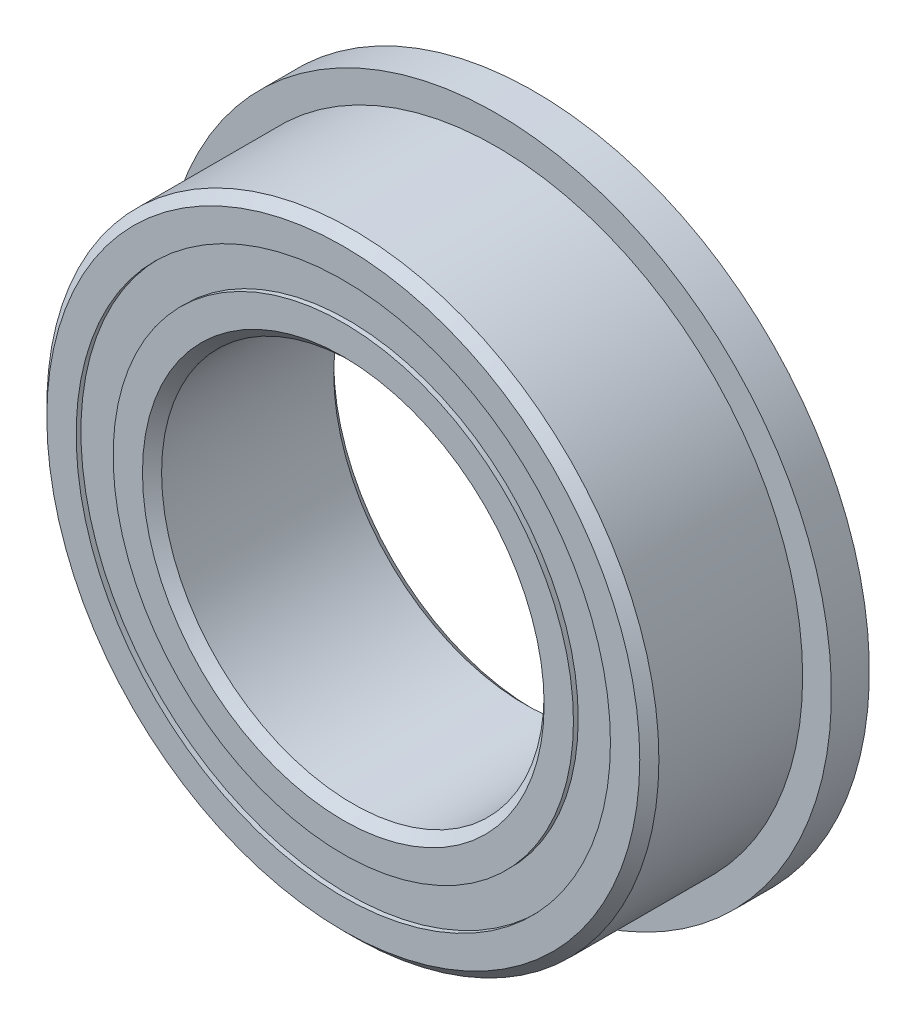
ISO-10303-21;
HEADER;
FILE_DESCRIPTION(('STEP AP214'),'2;1');
FILE_NAME('part.step','',(''),(''),'','','');
FILE_SCHEMA(('AUTOMOTIVE_DESIGN { 1 0 10303 214 1 1 1 1 }'));
ENDSEC;
DATA;
#1=APPLICATION_CONTEXT('core data for automotive mechanical design processes');
#2=APPLICATION_PROTOCOL_DEFINITION('international standard','automotive_design',2000,#1);
#3=PRODUCT_CONTEXT('',#1,'mechanical');
#4=PRODUCT('Part','Part','',(#3));
#5=PRODUCT_RELATED_PRODUCT_CATEGORY('part','',(#4));
#6=PRODUCT_DEFINITION_FORMATION('','',#4);
#7=PRODUCT_DEFINITION_CONTEXT('part definition',#1,'design');
#8=PRODUCT_DEFINITION('design','',#6,#7);
#9=PRODUCT_DEFINITION_SHAPE('','',#8);
#10=(LENGTH_UNIT() NAMED_UNIT(*) SI_UNIT(.MILLI.,.METRE.));
#11=(NAMED_UNIT(*) PLANE_ANGLE_UNIT() SI_UNIT($,.RADIAN.));
#12=(NAMED_UNIT(*) SI_UNIT($,.STERADIAN.) SOLID_ANGLE_UNIT());
#13=UNCERTAINTY_MEASURE_WITH_UNIT(LENGTH_MEASURE(1.E-05),#10,'distance_accuracy_value','');
#14=(GEOMETRIC_REPRESENTATION_CONTEXT(3) GLOBAL_UNCERTAINTY_ASSIGNED_CONTEXT((#13)) GLOBAL_UNIT_ASSIGNED_CONTEXT((#10,
#11,#12)) REPRESENTATION_CONTEXT('',''));
#15=CARTESIAN_POINT('',(0.,0.,0.));
#16=DIRECTION('',(0.,0.,1.));
#17=DIRECTION('',(1.,0.,0.));
#18=AXIS2_PLACEMENT_3D('',#15,#16,#17);
#19=CARTESIAN_POINT('',(0.,5.54316620879121,-1.88515625));
#20=DIRECTION('',(0.,0.,1.));
#21=DIRECTION('',(1.,0.,0.));
#22=AXIS2_PLACEMENT_3D('',#19,#20,#21);
#23=PLANE('',#22);
#24=CARTESIAN_POINT('',(0.,0.,-1.88515625));
#25=DIRECTION('',(0.,0.,1.));
#26=DIRECTION('',(1.,0.,0.));
#27=AXIS2_PLACEMENT_3D('',#24,#25,#26);
#28=CIRCLE('',#27,5.54316620879121);
#29=CARTESIAN_POINT('',(5.54316620879121,0.,-1.88515625));
#30=VERTEX_POINT('',#29);
#31=EDGE_CURVE('E57',#30,#30,#28,.T.);
#32=ORIENTED_EDGE('',*,*,#31,.F.);
#33=EDGE_LOOP('',(#32));
#34=FACE_BOUND('',#33,.T.);
#35=CARTESIAN_POINT('',(0.,0.,-1.88515625));
#36=DIRECTION('',(0.,0.,1.));
#37=DIRECTION('',(1.,0.,0.));
#38=AXIS2_PLACEMENT_3D('',#35,#36,#37);
#39=CIRCLE('',#38,4.77558379120879);
#40=CARTESIAN_POINT('',(4.77558379120879,0.,-1.88515625));
#41=VERTEX_POINT('',#40);
#42=EDGE_CURVE('E11',#41,#41,#39,.T.);
#43=ORIENTED_EDGE('',*,*,#42,.T.);
#44=EDGE_LOOP('',(#43));
#45=FACE_BOUND('',#44,.T.);
#46=ADVANCED_FACE('F43',(#34,#45),#23,.F.);
#47=CARTESIAN_POINT('',(0.,0.,1.984375));
#48=DIRECTION('',(0.,0.,1.));
#49=DIRECTION('',(1.,0.,0.));
#50=AXIS2_PLACEMENT_3D('',#47,#48,#49);
#51=CYLINDRICAL_SURFACE('',#50,4.77558379120879);
#52=ORIENTED_EDGE('',*,*,#42,.F.);
#53=EDGE_LOOP('',(#52));
#54=FACE_BOUND('',#53,.T.);
#55=CARTESIAN_POINT('',(0.,0.,-0.961832467237323));
#56=DIRECTION('',(0.,0.,1.));
#57=DIRECTION('',(1.,0.,0.));
#58=AXIS2_PLACEMENT_3D('',#55,#56,#57);
#59=CIRCLE('',#58,4.77558379120879);
#60=CARTESIAN_POINT('',(4.77558379120879,0.,-0.961832467237323));
#61=VERTEX_POINT('',#60);
#62=EDGE_CURVE('E49',#61,#61,#59,.T.);
#63=ORIENTED_EDGE('',*,*,#62,.T.);
#64=EDGE_LOOP('',(#63));
#65=FACE_BOUND('',#64,.T.);
#66=ADVANCED_FACE('F66',(#54,#65),#51,.F.);
#67=CARTESIAN_POINT('',(0.,5.54316620879121,-0.961832467237323));
#68=DIRECTION('',(0.,0.,-1.));
#69=DIRECTION('',(-1.,0.,0.));
#70=AXIS2_PLACEMENT_3D('',#67,#68,#69);
#71=PLANE('',#70);
#72=ORIENTED_EDGE('',*,*,#62,.F.);
#73=EDGE_LOOP('',(#72));
#74=FACE_BOUND('',#73,.T.);
#75=CARTESIAN_POINT('',(0.,0.,-0.961832467237323));
#76=DIRECTION('',(0.,0.,1.));
#77=DIRECTION('',(1.,0.,0.));
#78=AXIS2_PLACEMENT_3D('',#75,#76,#77);
#79=CIRCLE('',#78,5.54316620879121);
#80=CARTESIAN_POINT('',(5.54316620879121,0.,-0.961832467237323));
#81=VERTEX_POINT('',#80);
#82=EDGE_CURVE('E53',#81,#81,#79,.T.);
#83=ORIENTED_EDGE('',*,*,#82,.T.);
#84=EDGE_LOOP('',(#83));
#85=FACE_BOUND('',#84,.T.);
#86=ADVANCED_FACE('F70',(#74,#85),#71,.F.);
#87=CARTESIAN_POINT('',(0.,0.,1.984375));
#88=DIRECTION('',(0.,0.,1.));
#89=DIRECTION('',(1.,0.,0.));
#90=AXIS2_PLACEMENT_3D('',#87,#88,#89);
#91=CYLINDRICAL_SURFACE('',#90,5.54316620879121);
#92=ORIENTED_EDGE('',*,*,#82,.F.);
#93=EDGE_LOOP('',(#92));
#94=FACE_BOUND('',#93,.T.);
#95=ORIENTED_EDGE('',*,*,#31,.T.);
#96=EDGE_LOOP('',(#95));
#97=FACE_BOUND('',#96,.T.);
#98=ADVANCED_FACE('F63',(#94,#97),#91,.T.);
#99=CLOSED_SHELL('',(#46,#66,#86,#98));
#100=MANIFOLD_SOLID_BREP('B2',#99);
#101=CARTESIAN_POINT('',(0.,5.54316620879121,1.88515625));
#102=DIRECTION('',(0.,0.,-1.));
#103=DIRECTION('',(-1.,0.,0.));
#104=AXIS2_PLACEMENT_3D('',#101,#102,#103);
#105=PLANE('',#104);
#106=CARTESIAN_POINT('',(0.,0.,1.88515625));
#107=DIRECTION('',(0.,0.,1.));
#108=DIRECTION('',(1.,0.,0.));
#109=AXIS2_PLACEMENT_3D('',#106,#107,#108);
#110=CIRCLE('',#109,4.77558379120879);
#111=CARTESIAN_POINT('',(4.77558379120879,0.,1.88515625));
#112=VERTEX_POINT('',#111);
#113=EDGE_CURVE('E42',#112,#112,#110,.T.);
#114=ORIENTED_EDGE('',*,*,#113,.F.);
#115=EDGE_LOOP('',(#114));
#116=FACE_BOUND('',#115,.T.);
#117=CARTESIAN_POINT('',(0.,0.,1.88515625));
#118=DIRECTION('',(0.,0.,1.));
#119=DIRECTION('',(1.,0.,0.));
#120=AXIS2_PLACEMENT_3D('',#117,#118,#119);
#121=CIRCLE('',#120,5.54316620879121);
#122=CARTESIAN_POINT('',(5.54316620879121,0.,1.88515625));
#123=VERTEX_POINT('',#122);
#124=EDGE_CURVE('E124',#123,#123,#121,.T.);
#125=ORIENTED_EDGE('',*,*,#124,.T.);
#126=EDGE_LOOP('',(#125));
#127=FACE_BOUND('',#126,.T.);
#128=ADVANCED_FACE('F110',(#116,#127),#105,.F.);
#129=CARTESIAN_POINT('',(0.,0.,1.984375));
#130=DIRECTION('',(0.,0.,1.));
#131=DIRECTION('',(1.,0.,0.));
#132=AXIS2_PLACEMENT_3D('',#129,#130,#131);
#133=CYLINDRICAL_SURFACE('',#132,4.77558379120879);
#134=CARTESIAN_POINT('',(0.,0.,0.961832467237324));
#135=DIRECTION('',(0.,0.,1.));
#136=DIRECTION('',(1.,0.,0.));
#137=AXIS2_PLACEMENT_3D('',#134,#135,#136);
#138=CIRCLE('',#137,4.77558379120879);
#139=CARTESIAN_POINT('',(4.77558379120879,0.,0.961832467237324));
#140=VERTEX_POINT('',#139);
#141=EDGE_CURVE('E116',#140,#140,#138,.T.);
#142=ORIENTED_EDGE('',*,*,#141,.F.);
#143=EDGE_LOOP('',(#142));
#144=FACE_BOUND('',#143,.T.);
#145=ORIENTED_EDGE('',*,*,#113,.T.);
#146=EDGE_LOOP('',(#145));
#147=FACE_BOUND('',#146,.T.);
#148=ADVANCED_FACE('F139',(#144,#147),#133,.F.);
#149=CARTESIAN_POINT('',(0.,5.54316620879121,0.961832467237324));
#150=DIRECTION('',(0.,0.,1.));
#151=DIRECTION('',(1.,0.,0.));
#152=AXIS2_PLACEMENT_3D('',#149,#150,#151);
#153=PLANE('',#152);
#154=CARTESIAN_POINT('',(0.,0.,0.961832467237324));
#155=DIRECTION('',(0.,0.,1.));
#156=DIRECTION('',(1.,0.,0.));
#157=AXIS2_PLACEMENT_3D('',#154,#155,#156);
#158=CIRCLE('',#157,5.54316620879121);
#159=CARTESIAN_POINT('',(5.54316620879121,0.,0.961832467237324));
#160=VERTEX_POINT('',#159);
#161=EDGE_CURVE('E120',#160,#160,#158,.T.);
#162=ORIENTED_EDGE('',*,*,#161,.F.);
#163=EDGE_LOOP('',(#162));
#164=FACE_BOUND('',#163,.T.);
#165=ORIENTED_EDGE('',*,*,#141,.T.);
#166=EDGE_LOOP('',(#165));
#167=FACE_BOUND('',#166,.T.);
#168=ADVANCED_FACE('F134',(#164,#167),#153,.F.);
#169=CARTESIAN_POINT('',(0.,0.,1.984375));
#170=DIRECTION('',(0.,0.,1.));
#171=DIRECTION('',(1.,0.,0.));
#172=AXIS2_PLACEMENT_3D('',#169,#170,#171);
#173=CYLINDRICAL_SURFACE('',#172,5.54316620879121);
#174=ORIENTED_EDGE('',*,*,#124,.F.);
#175=EDGE_LOOP('',(#174));
#176=FACE_BOUND('',#175,.T.);
#177=ORIENTED_EDGE('',*,*,#161,.T.);
#178=EDGE_LOOP('',(#177));
#179=FACE_BOUND('',#178,.T.);
#180=ADVANCED_FACE('F131',(#176,#179),#173,.T.);
#181=CLOSED_SHELL('',(#128,#148,#168,#180));
#182=MANIFOLD_SOLID_BREP('B6',#181);
#183=CARTESIAN_POINT('',(-2.57968749999994,4.46814981765037,0.));
#184=DIRECTION('',(0.,0.,1.));
#185=DIRECTION('',(-0.499999999999989,0.866025403784445,0.));
#186=AXIS2_PLACEMENT_3D('',#183,#184,#185);
#187=SPHERICAL_SURFACE('',#186,0.961832467237323);
#188=CARTESIAN_POINT('',(-2.57968749999994,4.46814981765037,0.961832467237324));
#189=VERTEX_POINT('',#188);
#190=VERTEX_LOOP('',#189);
#191=FACE_BOUND('',#190,.T.);
#192=ADVANCED_FACE('F177',(#191),#187,.T.);
#193=CLOSED_SHELL('',(#192));
#194=MANIFOLD_SOLID_BREP('B37',#193);
#195=CARTESIAN_POINT('',(-4.46814981765031,2.57968750000005,0.));
#196=DIRECTION('',(0.,0.,1.));
#197=DIRECTION('',(-0.866025403784433,0.50000000000001,0.));
#198=AXIS2_PLACEMENT_3D('',#195,#196,#197);
#199=SPHERICAL_SURFACE('',#198,0.961832467237323);
#200=CARTESIAN_POINT('',(-4.46814981765031,2.57968750000005,0.961832467237324));
#201=VERTEX_POINT('',#200);
#202=VERTEX_LOOP('',#201);
#203=FACE_BOUND('',#202,.T.);
#204=ADVANCED_FACE('F197',(#203),#199,.T.);
#205=CLOSED_SHELL('',(#204));
#206=MANIFOLD_SOLID_BREP('B106',#205);
#207=CARTESIAN_POINT('',(-5.159375,0.,0.));
#208=DIRECTION('',(0.,0.,1.));
#209=DIRECTION('',(-1.,0.,0.));
#210=AXIS2_PLACEMENT_3D('',#207,#208,#209);
#211=SPHERICAL_SURFACE('',#210,0.961832467237323);
#212=CARTESIAN_POINT('',(-5.159375,0.,0.961832467237324));
#213=VERTEX_POINT('',#212);
#214=VERTEX_LOOP('',#213);
#215=FACE_BOUND('',#214,.T.);
#216=ADVANCED_FACE('F217',(#215),#211,.T.);
#217=CLOSED_SHELL('',(#216));
#218=MANIFOLD_SOLID_BREP('B173',#217);
#219=CARTESIAN_POINT('',(-4.46814981765036,-2.57968749999996,0.));
#220=DIRECTION('',(0.,0.,1.));
#221=DIRECTION('',(-0.866025403784443,-0.499999999999992,0.));
#222=AXIS2_PLACEMENT_3D('',#219,#220,#221);
#223=SPHERICAL_SURFACE('',#222,0.961832467237323);
#224=CARTESIAN_POINT('',(-4.46814981765036,-2.57968749999996,0.961832467237324));
#225=VERTEX_POINT('',#224);
#226=VERTEX_LOOP('',#225);
#227=FACE_BOUND('',#226,.T.);
#228=ADVANCED_FACE('F237',(#227),#223,.T.);
#229=CLOSED_SHELL('',(#228));
#230=MANIFOLD_SOLID_BREP('B193',#229);
#231=CARTESIAN_POINT('',(-2.57968750000004,-4.46814981765032,0.));
#232=DIRECTION('',(0.,0.,1.));
#233=DIRECTION('',(-0.500000000000007,-0.866025403784435,0.));
#234=AXIS2_PLACEMENT_3D('',#231,#232,#233);
#235=SPHERICAL_SURFACE('',#234,0.961832467237323);
#236=CARTESIAN_POINT('',(-2.57968750000004,-4.46814981765032,0.961832467237324));
#237=VERTEX_POINT('',#236);
#238=VERTEX_LOOP('',#237);
#239=FACE_BOUND('',#238,.T.);
#240=ADVANCED_FACE('F257',(#239),#235,.T.);
#241=CLOSED_SHELL('',(#240));
#242=MANIFOLD_SOLID_BREP('B213',#241);
#243=CARTESIAN_POINT('',(0.,-5.159375,0.));
#244=DIRECTION('',(0.,0.,1.));
#245=DIRECTION('',(0.,-1.,0.));
#246=AXIS2_PLACEMENT_3D('',#243,#244,#245);
#247=SPHERICAL_SURFACE('',#246,0.961832467237323);
#248=CARTESIAN_POINT('',(0.,-5.159375,0.961832467237324));
#249=VERTEX_POINT('',#248);
#250=VERTEX_LOOP('',#249);
#251=FACE_BOUND('',#250,.T.);
#252=ADVANCED_FACE('F277',(#251),#247,.T.);
#253=CLOSED_SHELL('',(#252));
#254=MANIFOLD_SOLID_BREP('B233',#253);
#255=CARTESIAN_POINT('',(2.57968749999997,-4.46814981765035,0.));
#256=DIRECTION('',(0.,0.,1.));
#257=DIRECTION('',(0.499999999999995,-0.866025403784442,0.));
#258=AXIS2_PLACEMENT_3D('',#255,#256,#257);
#259=SPHERICAL_SURFACE('',#258,0.961832467237323);
#260=CARTESIAN_POINT('',(2.57968749999997,-4.46814981765035,0.961832467237324));
#261=VERTEX_POINT('',#260);
#262=VERTEX_LOOP('',#261);
#263=FACE_BOUND('',#262,.T.);
#264=ADVANCED_FACE('F297',(#263),#259,.T.);
#265=CLOSED_SHELL('',(#264));
#266=MANIFOLD_SOLID_BREP('B253',#265);
#267=CARTESIAN_POINT('',(4.46814981765033,-2.57968750000002,0.));
#268=DIRECTION('',(0.,0.,1.));
#269=DIRECTION('',(0.866025403784436,-0.500000000000004,0.));
#270=AXIS2_PLACEMENT_3D('',#267,#268,#269);
#271=SPHERICAL_SURFACE('',#270,0.961832467237323);
#272=CARTESIAN_POINT('',(4.46814981765033,-2.57968750000002,0.961832467237324));
#273=VERTEX_POINT('',#272);
#274=VERTEX_LOOP('',#273);
#275=FACE_BOUND('',#274,.T.);
#276=ADVANCED_FACE('F317',(#275),#271,.T.);
#277=CLOSED_SHELL('',(#276));
#278=MANIFOLD_SOLID_BREP('B273',#277);
#279=CARTESIAN_POINT('',(5.159375,0.,0.));
#280=DIRECTION('',(0.,0.,1.));
#281=DIRECTION('',(1.,0.,0.));
#282=AXIS2_PLACEMENT_3D('',#279,#280,#281);
#283=SPHERICAL_SURFACE('',#282,0.961832467237323);
#284=CARTESIAN_POINT('',(5.159375,0.,0.961832467237324));
#285=VERTEX_POINT('',#284);
#286=VERTEX_LOOP('',#285);
#287=FACE_BOUND('',#286,.T.);
#288=ADVANCED_FACE('F337',(#287),#283,.T.);
#289=CLOSED_SHELL('',(#288));
#290=MANIFOLD_SOLID_BREP('B293',#289);
#291=CARTESIAN_POINT('',(4.46814981765034,2.57968749999999,0.));
#292=DIRECTION('',(0.,0.,1.));
#293=DIRECTION('',(0.86602540378444,0.499999999999998,0.));
#294=AXIS2_PLACEMENT_3D('',#291,#292,#293);
#295=SPHERICAL_SURFACE('',#294,0.961832467237323);
#296=CARTESIAN_POINT('',(4.46814981765034,2.57968749999999,0.961832467237324));
#297=VERTEX_POINT('',#296);
#298=VERTEX_LOOP('',#297);
#299=FACE_BOUND('',#298,.T.);
#300=ADVANCED_FACE('F357',(#299),#295,.T.);
#301=CLOSED_SHELL('',(#300));
#302=MANIFOLD_SOLID_BREP('B313',#301);
#303=CARTESIAN_POINT('',(2.57968750000001,4.46814981765033,0.));
#304=DIRECTION('',(0.,0.,1.));
#305=DIRECTION('',(0.500000000000001,0.866025403784438,0.));
#306=AXIS2_PLACEMENT_3D('',#303,#304,#305);
#307=SPHERICAL_SURFACE('',#306,0.961832467237323);
#308=CARTESIAN_POINT('',(2.57968750000001,4.46814981765033,0.961832467237324));
#309=VERTEX_POINT('',#308);
#310=VERTEX_LOOP('',#309);
#311=FACE_BOUND('',#310,.T.);
#312=ADVANCED_FACE('F377',(#311),#307,.T.);
#313=CLOSED_SHELL('',(#312));
#314=MANIFOLD_SOLID_BREP('B333',#313);
#315=CARTESIAN_POINT('',(0.,5.159375,0.));
#316=DIRECTION('',(0.,0.,1.));
#317=DIRECTION('',(0.,1.,0.));
#318=AXIS2_PLACEMENT_3D('',#315,#316,#317);
#319=SPHERICAL_SURFACE('',#318,0.961832467237323);
#320=CARTESIAN_POINT('',(0.,5.159375,0.961832467237324));
#321=VERTEX_POINT('',#320);
#322=VERTEX_LOOP('',#321);
#323=FACE_BOUND('',#322,.T.);
#324=ADVANCED_FACE('F399',(#323),#319,.T.);
#325=CLOSED_SHELL('',(#324));
#326=MANIFOLD_SOLID_BREP('B353',#325);
#327=CARTESIAN_POINT('',(0.,4.77558379120879,1.984375));
#328=DIRECTION('',(0.,0.,-1.));
#329=DIRECTION('',(-1.,0.,0.));
#330=AXIS2_PLACEMENT_3D('',#327,#328,#329);
#331=PLANE('',#330);
#332=CARTESIAN_POINT('',(0.,0.,1.984375));
#333=DIRECTION('',(0.,0.,1.));
#334=DIRECTION('',(1.,0.,0.));
#335=AXIS2_PLACEMENT_3D('',#332,#333,#334);
#336=CIRCLE('',#335,4.1671875);
#337=CARTESIAN_POINT('',(4.1671875,0.,1.984375));
#338=VERTEX_POINT('',#337);
#339=EDGE_CURVE('E446',#338,#338,#336,.T.);
#340=ORIENTED_EDGE('',*,*,#339,.F.);
#341=EDGE_LOOP('',(#340));
#342=FACE_BOUND('',#341,.T.);
#343=CARTESIAN_POINT('',(0.,0.,1.984375));
#344=DIRECTION('',(0.,0.,1.));
#345=DIRECTION('',(1.,0.,0.));
#346=AXIS2_PLACEMENT_3D('',#343,#344,#345);
#347=CIRCLE('',#346,4.77558379120879);
#348=CARTESIAN_POINT('',(4.77558379120879,0.,1.984375));
#349=VERTEX_POINT('',#348);
#350=EDGE_CURVE('E398',#349,#349,#347,.T.);
#351=ORIENTED_EDGE('',*,*,#350,.T.);
#352=EDGE_LOOP('',(#351));
#353=FACE_BOUND('',#352,.T.);
#354=ADVANCED_FACE('F418',(#342,#353),#331,.F.);
#355=CARTESIAN_POINT('',(0.,0.,1.984375));
#356=DIRECTION('',(0.,0.,1.));
#357=DIRECTION('',(1.,0.,0.));
#358=AXIS2_PLACEMENT_3D('',#355,#356,#357);
#359=CYLINDRICAL_SURFACE('',#358,4.77558379120879);
#360=ORIENTED_EDGE('',*,*,#350,.F.);
#361=EDGE_LOOP('',(#360));
#362=FACE_BOUND('',#361,.T.);
#363=CARTESIAN_POINT('',(0.,0.,0.881944444444445));
#364=DIRECTION('',(0.,0.,1.));
#365=DIRECTION('',(1.,0.,0.));
#366=AXIS2_PLACEMENT_3D('',#363,#364,#365);
#367=CIRCLE('',#366,4.77558379120879);
#368=CARTESIAN_POINT('',(4.77558379120879,0.,0.881944444444445));
#369=VERTEX_POINT('',#368);
#370=EDGE_CURVE('E424',#369,#369,#367,.T.);
#371=ORIENTED_EDGE('',*,*,#370,.T.);
#372=EDGE_LOOP('',(#371));
#373=FACE_BOUND('',#372,.T.);
#374=ADVANCED_FACE('F453',(#362,#373),#359,.T.);
#375=CARTESIAN_POINT('',(0.,0.,0.));
#376=DIRECTION('',(0.,0.,1.));
#377=DIRECTION('',(1.,0.,0.));
#378=AXIS2_PLACEMENT_3D('',#375,#376,#377);
#379=TOROIDAL_SURFACE('',#378,5.159375,0.961832467237322);
#380=ORIENTED_EDGE('',*,*,#370,.F.);
#381=EDGE_LOOP('',(#380));
#382=FACE_BOUND('',#381,.T.);
#383=CARTESIAN_POINT('',(0.,0.,-0.881944444444447));
#384=DIRECTION('',(0.,0.,1.));
#385=DIRECTION('',(1.,0.,0.));
#386=AXIS2_PLACEMENT_3D('',#383,#384,#385);
#387=CIRCLE('',#386,4.77558379120879);
#388=CARTESIAN_POINT('',(4.77558379120879,0.,-0.881944444444447));
#389=VERTEX_POINT('',#388);
#390=EDGE_CURVE('E428',#389,#389,#387,.T.);
#391=ORIENTED_EDGE('',*,*,#390,.T.);
#392=EDGE_LOOP('',(#391));
#393=FACE_BOUND('',#392,.T.);
#394=ADVANCED_FACE('F457',(#382,#393),#379,.F.);
#395=CARTESIAN_POINT('',(0.,0.,1.984375));
#396=DIRECTION('',(0.,0.,1.));
#397=DIRECTION('',(1.,0.,0.));
#398=AXIS2_PLACEMENT_3D('',#395,#396,#397);
#399=CYLINDRICAL_SURFACE('',#398,4.77558379120879);
#400=ORIENTED_EDGE('',*,*,#390,.F.);
#401=EDGE_LOOP('',(#400));
#402=FACE_BOUND('',#401,.T.);
#403=CARTESIAN_POINT('',(0.,0.,-1.984375));
#404=DIRECTION('',(0.,0.,1.));
#405=DIRECTION('',(1.,0.,0.));
#406=AXIS2_PLACEMENT_3D('',#403,#404,#405);
#407=CIRCLE('',#406,4.77558379120879);
#408=CARTESIAN_POINT('',(4.77558379120879,0.,-1.984375));
#409=VERTEX_POINT('',#408);
#410=EDGE_CURVE('E432',#409,#409,#407,.T.);
#411=ORIENTED_EDGE('',*,*,#410,.T.);
#412=EDGE_LOOP('',(#411));
#413=FACE_BOUND('',#412,.T.);
#414=ADVANCED_FACE('F462',(#402,#413),#399,.T.);
#415=CARTESIAN_POINT('',(0.,4.1671875,-1.984375));
#416=DIRECTION('',(0.,0.,1.));
#417=DIRECTION('',(1.,0.,0.));
#418=AXIS2_PLACEMENT_3D('',#415,#416,#417);
#419=PLANE('',#418);
#420=ORIENTED_EDGE('',*,*,#410,.F.);
#421=EDGE_LOOP('',(#420));
#422=FACE_BOUND('',#421,.T.);
#423=CARTESIAN_POINT('',(0.,0.,-1.984375));
#424=DIRECTION('',(0.,0.,1.));
#425=DIRECTION('',(1.,0.,0.));
#426=AXIS2_PLACEMENT_3D('',#423,#424,#425);
#427=CIRCLE('',#426,4.1671875);
#428=CARTESIAN_POINT('',(4.1671875,0.,-1.984375));
#429=VERTEX_POINT('',#428);
#430=EDGE_CURVE('E437',#429,#429,#427,.T.);
#431=ORIENTED_EDGE('',*,*,#430,.T.);
#432=EDGE_LOOP('',(#431));
#433=FACE_BOUND('',#432,.T.);
#434=ADVANCED_FACE('F468',(#422,#433),#419,.F.);
#435=CARTESIAN_POINT('',(0.,0.,-1.7859375));
#436=DIRECTION('',(0.,0.,-1.));
#437=DIRECTION('',(-1.,0.,0.));
#438=AXIS2_PLACEMENT_3D('',#435,#436,#437);
#439=CONICAL_SURFACE('',#438,3.96875,0.785398163397448);
#440=ORIENTED_EDGE('',*,*,#430,.F.);
#441=EDGE_LOOP('',(#440));
#442=FACE_BOUND('',#441,.T.);
#443=CARTESIAN_POINT('',(0.,0.,-1.7859375));
#444=DIRECTION('',(0.,0.,1.));
#445=DIRECTION('',(1.,0.,0.));
#446=AXIS2_PLACEMENT_3D('',#443,#444,#445);
#447=CIRCLE('',#446,3.96875);
#448=CARTESIAN_POINT('',(3.96875,0.,-1.7859375));
#449=VERTEX_POINT('',#448);
#450=EDGE_CURVE('E440',#449,#449,#447,.T.);
#451=ORIENTED_EDGE('',*,*,#450,.T.);
#452=EDGE_LOOP('',(#451));
#453=FACE_BOUND('',#452,.T.);
#454=ADVANCED_FACE('F472',(#442,#453),#439,.F.);
#455=CARTESIAN_POINT('',(0.,0.,1.984375));
#456=DIRECTION('',(0.,0.,1.));
#457=DIRECTION('',(1.,0.,0.));
#458=AXIS2_PLACEMENT_3D('',#455,#456,#457);
#459=CYLINDRICAL_SURFACE('',#458,3.96875);
#460=ORIENTED_EDGE('',*,*,#450,.F.);
#461=EDGE_LOOP('',(#460));
#462=FACE_BOUND('',#461,.T.);
#463=CARTESIAN_POINT('',(0.,0.,1.7859375));
#464=DIRECTION('',(0.,0.,1.));
#465=DIRECTION('',(1.,0.,0.));
#466=AXIS2_PLACEMENT_3D('',#463,#464,#465);
#467=CIRCLE('',#466,3.96875);
#468=CARTESIAN_POINT('',(3.96875,0.,1.7859375));
#469=VERTEX_POINT('',#468);
#470=EDGE_CURVE('E443',#469,#469,#467,.T.);
#471=ORIENTED_EDGE('',*,*,#470,.T.);
#472=EDGE_LOOP('',(#471));
#473=FACE_BOUND('',#472,.T.);
#474=ADVANCED_FACE('F476',(#462,#473),#459,.F.);
#475=CARTESIAN_POINT('',(0.,0.,1.984375));
#476=DIRECTION('',(0.,0.,1.));
#477=DIRECTION('',(1.,0.,0.));
#478=AXIS2_PLACEMENT_3D('',#475,#476,#477);
#479=CONICAL_SURFACE('',#478,4.1671875,0.785398163397447);
#480=ORIENTED_EDGE('',*,*,#470,.F.);
#481=EDGE_LOOP('',(#480));
#482=FACE_BOUND('',#481,.T.);
#483=ORIENTED_EDGE('',*,*,#339,.T.);
#484=EDGE_LOOP('',(#483));
#485=FACE_BOUND('',#484,.T.);
#486=ADVANCED_FACE('F450',(#482,#485),#479,.F.);
#487=CLOSED_SHELL('',(#354,#374,#394,#414,#434,#454,#474,#486));
#488=MANIFOLD_SOLID_BREP('B373',#487);
#489=CARTESIAN_POINT('',(0.,0.,1.7859375));
#490=DIRECTION('',(0.,0.,-1.));
#491=DIRECTION('',(-1.,0.,0.));
#492=AXIS2_PLACEMENT_3D('',#489,#490,#491);
#493=CONICAL_SURFACE('',#492,6.35,0.785398163397448);
#494=CARTESIAN_POINT('',(0.,0.,1.984375));
#495=DIRECTION('',(0.,0.,1.));
#496=DIRECTION('',(1.,0.,0.));
#497=AXIS2_PLACEMENT_3D('',#494,#495,#496);
#498=CIRCLE('',#497,6.1515625);
#499=CARTESIAN_POINT('',(6.1515625,0.,1.984375));
#500=VERTEX_POINT('',#499);
#501=EDGE_CURVE('E561',#500,#500,#498,.T.);
#502=ORIENTED_EDGE('',*,*,#501,.F.);
#503=EDGE_LOOP('',(#502));
#504=FACE_BOUND('',#503,.T.);
#505=CARTESIAN_POINT('',(0.,0.,1.7859375));
#506=DIRECTION('',(0.,0.,1.));
#507=DIRECTION('',(1.,0.,0.));
#508=AXIS2_PLACEMENT_3D('',#505,#506,#507);
#509=CIRCLE('',#508,6.35);
#510=CARTESIAN_POINT('',(6.35,0.,1.7859375));
#511=VERTEX_POINT('',#510);
#512=EDGE_CURVE('E417',#511,#511,#509,.T.);
#513=ORIENTED_EDGE('',*,*,#512,.T.);
#514=EDGE_LOOP('',(#513));
#515=FACE_BOUND('',#514,.T.);
#516=ADVANCED_FACE('F539',(#504,#515),#493,.T.);
#517=CARTESIAN_POINT('',(0.,0.,1.984375));
#518=DIRECTION('',(0.,0.,1.));
#519=DIRECTION('',(1.,0.,0.));
#520=AXIS2_PLACEMENT_3D('',#517,#518,#519);
#521=CYLINDRICAL_SURFACE('',#520,6.35);
#522=CARTESIAN_POINT('',(0.,0.,-1.196975));
#523=DIRECTION('',(0.,0.,1.));
#524=DIRECTION('',(1.,0.,0.));
#525=AXIS2_PLACEMENT_3D('',#522,#523,#524);
#526=CIRCLE('',#525,6.35);
#527=CARTESIAN_POINT('',(6.35,0.,-1.196975));
#528=VERTEX_POINT('',#527);
#529=EDGE_CURVE('E564',#528,#528,#526,.T.);
#530=ORIENTED_EDGE('',*,*,#529,.T.);
#531=EDGE_LOOP('',(#530));
#532=FACE_BOUND('',#531,.T.);
#533=ORIENTED_EDGE('',*,*,#512,.F.);
#534=EDGE_LOOP('',(#533));
#535=FACE_BOUND('',#534,.T.);
#536=ADVANCED_FACE('F584',(#532,#535),#521,.T.);
#537=CARTESIAN_POINT('',(0.,6.1515625,-1.984375));
#538=DIRECTION('',(0.,0.,1.));
#539=DIRECTION('',(1.,0.,0.));
#540=AXIS2_PLACEMENT_3D('',#537,#538,#539);
#541=PLANE('',#540);
#542=CARTESIAN_POINT('',(0.,0.,-1.984375));
#543=DIRECTION('',(0.,0.,1.));
#544=DIRECTION('',(1.,0.,0.));
#545=AXIS2_PLACEMENT_3D('',#542,#543,#544);
#546=CIRCLE('',#545,5.54316620879121);
#547=CARTESIAN_POINT('',(5.54316620879121,0.,-1.984375));
#548=VERTEX_POINT('',#547);
#549=EDGE_CURVE('E545',#548,#548,#546,.T.);
#550=ORIENTED_EDGE('',*,*,#549,.T.);
#551=EDGE_LOOP('',(#550));
#552=FACE_BOUND('',#551,.T.);
#553=CARTESIAN_POINT('',(0.,0.,-1.984375));
#554=DIRECTION('',(0.,0.,-1.));
#555=DIRECTION('',(-1.,0.,0.));
#556=AXIS2_PLACEMENT_3D('',#553,#554,#555);
#557=CIRCLE('',#556,6.9469);
#558=CARTESIAN_POINT('',(-6.9469,0.,-1.984375));
#559=VERTEX_POINT('',#558);
#560=EDGE_CURVE('E567',#559,#559,#557,.T.);
#561=ORIENTED_EDGE('',*,*,#560,.T.);
#562=EDGE_LOOP('',(#561));
#563=FACE_BOUND('',#562,.T.);
#564=ADVANCED_FACE('F587',(#552,#563),#541,.F.);
#565=CARTESIAN_POINT('',(0.,0.,1.984375));
#566=DIRECTION('',(0.,0.,1.));
#567=DIRECTION('',(1.,0.,0.));
#568=AXIS2_PLACEMENT_3D('',#565,#566,#567);
#569=CYLINDRICAL_SURFACE('',#568,5.54316620879121);
#570=CARTESIAN_POINT('',(0.,0.,-0.881944444444444));
#571=DIRECTION('',(0.,0.,1.));
#572=DIRECTION('',(1.,0.,0.));
#573=AXIS2_PLACEMENT_3D('',#570,#571,#572);
#574=CIRCLE('',#573,5.54316620879121);
#575=CARTESIAN_POINT('',(5.54316620879121,0.,-0.881944444444444));
#576=VERTEX_POINT('',#575);
#577=EDGE_CURVE('E549',#576,#576,#574,.T.);
#578=ORIENTED_EDGE('',*,*,#577,.T.);
#579=EDGE_LOOP('',(#578));
#580=FACE_BOUND('',#579,.T.);
#581=ORIENTED_EDGE('',*,*,#549,.F.);
#582=EDGE_LOOP('',(#581));
#583=FACE_BOUND('',#582,.T.);
#584=ADVANCED_FACE('F592',(#580,#583),#569,.F.);
#585=CARTESIAN_POINT('',(0.,0.,0.));
#586=DIRECTION('',(0.,0.,1.));
#587=DIRECTION('',(1.,0.,0.));
#588=AXIS2_PLACEMENT_3D('',#585,#586,#587);
#589=TOROIDAL_SURFACE('',#588,5.159375,0.961832467237323);
#590=ORIENTED_EDGE('',*,*,#577,.F.);
#591=EDGE_LOOP('',(#590));
#592=FACE_BOUND('',#591,.T.);
#593=CARTESIAN_POINT('',(0.,0.,0.881944444444445));
#594=DIRECTION('',(0.,0.,1.));
#595=DIRECTION('',(1.,0.,0.));
#596=AXIS2_PLACEMENT_3D('',#593,#594,#595);
#597=CIRCLE('',#596,5.54316620879121);
#598=CARTESIAN_POINT('',(5.54316620879121,0.,0.881944444444445));
#599=VERTEX_POINT('',#598);
#600=EDGE_CURVE('E553',#599,#599,#597,.T.);
#601=ORIENTED_EDGE('',*,*,#600,.T.);
#602=EDGE_LOOP('',(#601));
#603=FACE_BOUND('',#602,.T.);
#604=ADVANCED_FACE('F598',(#592,#603),#589,.F.);
#605=CARTESIAN_POINT('',(0.,0.,1.984375));
#606=DIRECTION('',(0.,0.,1.));
#607=DIRECTION('',(1.,0.,0.));
#608=AXIS2_PLACEMENT_3D('',#605,#606,#607);
#609=CYLINDRICAL_SURFACE('',#608,5.54316620879121);
#610=ORIENTED_EDGE('',*,*,#600,.F.);
#611=EDGE_LOOP('',(#610));
#612=FACE_BOUND('',#611,.T.);
#613=CARTESIAN_POINT('',(0.,0.,1.984375));
#614=DIRECTION('',(0.,0.,1.));
#615=DIRECTION('',(1.,0.,0.));
#616=AXIS2_PLACEMENT_3D('',#613,#614,#615);
#617=CIRCLE('',#616,5.54316620879121);
#618=CARTESIAN_POINT('',(5.54316620879121,0.,1.984375));
#619=VERTEX_POINT('',#618);
#620=EDGE_CURVE('E558',#619,#619,#617,.T.);
#621=ORIENTED_EDGE('',*,*,#620,.T.);
#622=EDGE_LOOP('',(#621));
#623=FACE_BOUND('',#622,.T.);
#624=ADVANCED_FACE('F602',(#612,#623),#609,.F.);
#625=CARTESIAN_POINT('',(0.,6.1515625,1.984375));
#626=DIRECTION('',(0.,0.,-1.));
#627=DIRECTION('',(-1.,0.,0.));
#628=AXIS2_PLACEMENT_3D('',#625,#626,#627);
#629=PLANE('',#628);
#630=ORIENTED_EDGE('',*,*,#620,.F.);
#631=EDGE_LOOP('',(#630));
#632=FACE_BOUND('',#631,.T.);
#633=ORIENTED_EDGE('',*,*,#501,.T.);
#634=EDGE_LOOP('',(#633));
#635=FACE_BOUND('',#634,.T.);
#636=ADVANCED_FACE('F580',(#632,#635),#629,.F.);
#637=CARTESIAN_POINT('',(0.,5.54316620879121,-1.196975));
#638=DIRECTION('',(0.,0.,1.));
#639=DIRECTION('',(1.,0.,0.));
#640=AXIS2_PLACEMENT_3D('',#637,#638,#639);
#641=PLANE('',#640);
#642=CARTESIAN_POINT('',(0.,0.,-1.196975));
#643=DIRECTION('',(0.,0.,-1.));
#644=DIRECTION('',(-1.,0.,0.));
#645=AXIS2_PLACEMENT_3D('',#642,#643,#644);
#646=CIRCLE('',#645,6.9469);
#647=CARTESIAN_POINT('',(-6.9469,0.,-1.196975));
#648=VERTEX_POINT('',#647);
#649=EDGE_CURVE('E570',#648,#648,#646,.T.);
#650=ORIENTED_EDGE('',*,*,#649,.F.);
#651=EDGE_LOOP('',(#650));
#652=FACE_BOUND('',#651,.T.);
#653=ORIENTED_EDGE('',*,*,#529,.F.);
#654=EDGE_LOOP('',(#653));
#655=FACE_BOUND('',#654,.T.);
#656=ADVANCED_FACE('F577',(#652,#655),#641,.T.);
#657=CARTESIAN_POINT('',(0.,0.,-1.984375));
#658=DIRECTION('',(0.,0.,-1.));
#659=DIRECTION('',(-1.,0.,0.));
#660=AXIS2_PLACEMENT_3D('',#657,#658,#659);
#661=CYLINDRICAL_SURFACE('',#660,6.9469);
#662=ORIENTED_EDGE('',*,*,#649,.T.);
#663=EDGE_LOOP('',(#662));
#664=FACE_BOUND('',#663,.T.);
#665=ORIENTED_EDGE('',*,*,#560,.F.);
#666=EDGE_LOOP('',(#665));
#667=FACE_BOUND('',#666,.T.);
#668=ADVANCED_FACE('F574',(#664,#667),#661,.T.);
#669=CLOSED_SHELL('',(#516,#536,#564,#584,#604,#624,#636,#656,#668));
#670=MANIFOLD_SOLID_BREP('B393',#669);
#671=ADVANCED_BREP_SHAPE_REPRESENTATION('',(#18,#100,#182,#194,#206,#218,#230,#242,#254,#266,
#278,#290,#302,#314,#326,#488,#670),#14);
#672=SHAPE_DEFINITION_REPRESENTATION(#9,#671);
ENDSEC;
END-ISO-10303-21;
